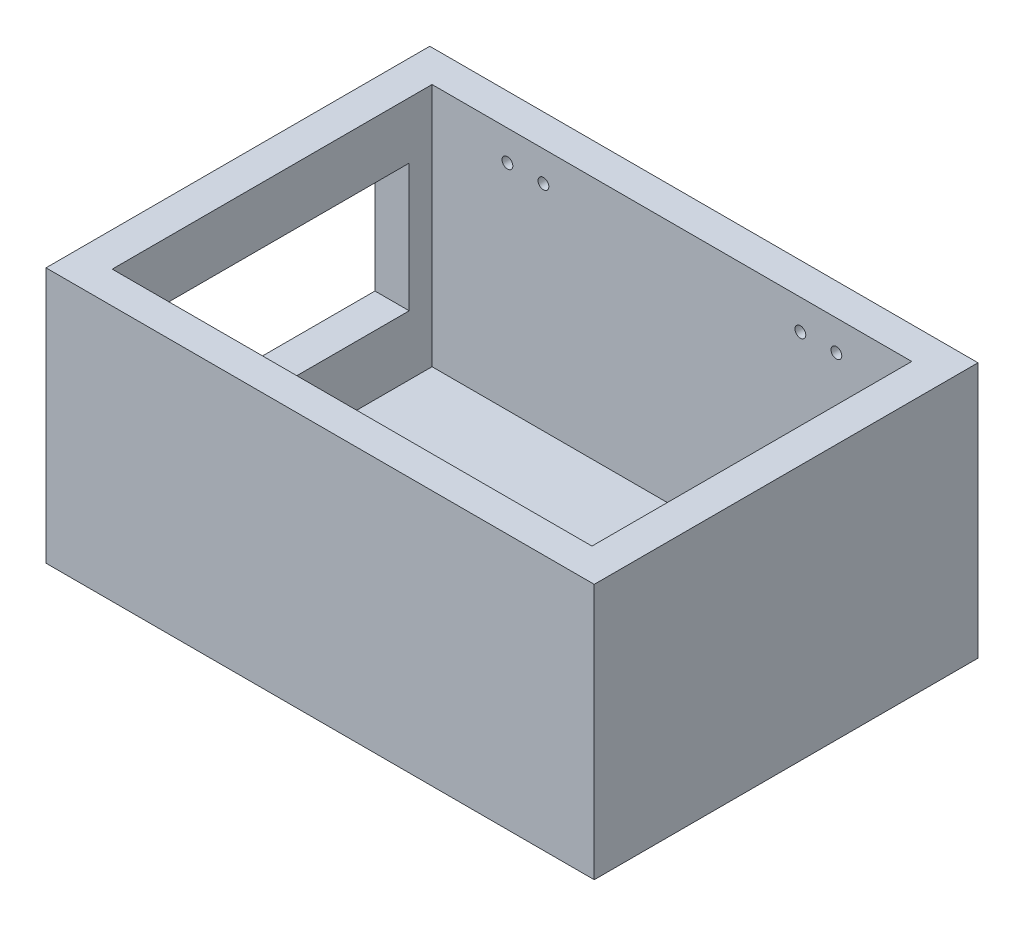
ISO-10303-21;
HEADER;
FILE_DESCRIPTION(('STEP AP214'),'2;1');
FILE_NAME('part.step','',(''),(''),'','','');
FILE_SCHEMA(('AUTOMOTIVE_DESIGN { 1 0 10303 214 1 1 1 1 }'));
ENDSEC;
DATA;
#1=APPLICATION_CONTEXT('core data for automotive mechanical design processes');
#2=APPLICATION_PROTOCOL_DEFINITION('international standard','automotive_design',2000,#1);
#3=PRODUCT_CONTEXT('',#1,'mechanical');
#4=PRODUCT('Part','Part','',(#3));
#5=PRODUCT_RELATED_PRODUCT_CATEGORY('part','',(#4));
#6=PRODUCT_DEFINITION_FORMATION('','',#4);
#7=PRODUCT_DEFINITION_CONTEXT('part definition',#1,'design');
#8=PRODUCT_DEFINITION('design','',#6,#7);
#9=PRODUCT_DEFINITION_SHAPE('','',#8);
#10=(LENGTH_UNIT() NAMED_UNIT(*) SI_UNIT(.MILLI.,.METRE.));
#11=(NAMED_UNIT(*) PLANE_ANGLE_UNIT() SI_UNIT($,.RADIAN.));
#12=(NAMED_UNIT(*) SI_UNIT($,.STERADIAN.) SOLID_ANGLE_UNIT());
#13=UNCERTAINTY_MEASURE_WITH_UNIT(LENGTH_MEASURE(1.E-05),#10,'distance_accuracy_value','');
#14=(GEOMETRIC_REPRESENTATION_CONTEXT(3) GLOBAL_UNCERTAINTY_ASSIGNED_CONTEXT((#13)) GLOBAL_UNIT_ASSIGNED_CONTEXT((#10,
#11,#12)) REPRESENTATION_CONTEXT('',''));
#15=CARTESIAN_POINT('',(0.,0.,0.));
#16=DIRECTION('',(0.,0.,1.));
#17=DIRECTION('',(1.,0.,0.));
#18=AXIS2_PLACEMENT_3D('',#15,#16,#17);
#19=CARTESIAN_POINT('',(142.875,3.175,97.79));
#20=DIRECTION('',(1.,0.,0.));
#21=DIRECTION('',(0.,0.,-1.));
#22=AXIS2_PLACEMENT_3D('',#19,#20,#21);
#23=PLANE('',#22);
#24=DIRECTION('',(0.,0.,1.));
#25=VECTOR('',#24,1.);
#26=CARTESIAN_POINT('',(142.875,52.705,42.418));
#27=LINE('',#26,#25);
#28=CARTESIAN_POINT('',(142.875,52.705,42.418));
#29=VERTEX_POINT('',#28);
#30=CARTESIAN_POINT('',(142.875,52.705,45.72));
#31=VERTEX_POINT('',#30);
#32=EDGE_CURVE('E327',#29,#31,#27,.T.);
#33=ORIENTED_EDGE('',*,*,#32,.T.);
#34=DIRECTION('',(0.,-1.,0.));
#35=VECTOR('',#34,1.);
#36=CARTESIAN_POINT('',(142.875,52.705,45.72));
#37=LINE('',#36,#35);
#38=CARTESIAN_POINT('',(142.875,3.175,45.72));
#39=VERTEX_POINT('',#38);
#40=EDGE_CURVE('E330',#31,#39,#37,.T.);
#41=ORIENTED_EDGE('',*,*,#40,.T.);
#42=DIRECTION('',(0.,0.,-1.));
#43=VECTOR('',#42,1.);
#44=CARTESIAN_POINT('',(142.875,3.175,97.79));
#45=LINE('',#44,#43);
#46=CARTESIAN_POINT('',(142.875,3.175,70.358));
#47=VERTEX_POINT('',#46);
#48=EDGE_CURVE('E383',#47,#39,#45,.T.);
#49=ORIENTED_EDGE('',*,*,#48,.F.);
#50=DIRECTION('',(0.,-1.,0.));
#51=VECTOR('',#50,1.);
#52=CARTESIAN_POINT('',(142.875,0.,70.358));
#53=LINE('',#52,#51);
#54=CARTESIAN_POINT('',(142.875,52.705,70.358));
#55=VERTEX_POINT('',#54);
#56=EDGE_CURVE('E357',#55,#47,#53,.T.);
#57=ORIENTED_EDGE('',*,*,#56,.F.);
#58=DIRECTION('',(0.,0.,-1.));
#59=VECTOR('',#58,1.);
#60=CARTESIAN_POINT('',(142.875,52.705,0.));
#61=LINE('',#60,#59);
#62=CARTESIAN_POINT('',(142.875,52.705,75.438));
#63=VERTEX_POINT('',#62);
#64=EDGE_CURVE('E332',#63,#55,#61,.T.);
#65=ORIENTED_EDGE('',*,*,#64,.F.);
#66=DIRECTION('',(0.,1.,0.));
#67=VECTOR('',#66,1.);
#68=CARTESIAN_POINT('',(142.875,0.,75.438));
#69=LINE('',#68,#67);
#70=CARTESIAN_POINT('',(142.875,3.175,75.438));
#71=VERTEX_POINT('',#70);
#72=EDGE_CURVE('E347',#71,#63,#69,.T.);
#73=ORIENTED_EDGE('',*,*,#72,.F.);
#74=CARTESIAN_POINT('',(142.875,3.175,97.79));
#75=VERTEX_POINT('',#74);
#76=EDGE_CURVE('E379',#75,#71,#45,.T.);
#77=ORIENTED_EDGE('',*,*,#76,.F.);
#78=DIRECTION('',(0.,1.,0.));
#79=VECTOR('',#78,1.);
#80=CARTESIAN_POINT('',(142.875,3.175,97.79));
#81=LINE('',#80,#79);
#82=CARTESIAN_POINT('',(142.875,71.12,97.79));
#83=VERTEX_POINT('',#82);
#84=EDGE_CURVE('E396',#75,#83,#81,.T.);
#85=ORIENTED_EDGE('',*,*,#84,.T.);
#86=DIRECTION('',(0.,0.,-1.));
#87=VECTOR('',#86,1.);
#88=CARTESIAN_POINT('',(142.875,71.12,97.79));
#89=LINE('',#88,#87);
#90=CARTESIAN_POINT('',(142.875,71.12,8.89));
#91=VERTEX_POINT('',#90);
#92=EDGE_CURVE('E374',#83,#91,#89,.T.);
#93=ORIENTED_EDGE('',*,*,#92,.T.);
#94=DIRECTION('',(0.,1.,0.));
#95=VECTOR('',#94,1.);
#96=CARTESIAN_POINT('',(142.875,3.175,8.89));
#97=LINE('',#96,#95);
#98=CARTESIAN_POINT('',(142.875,3.175,8.89));
#99=VERTEX_POINT('',#98);
#100=EDGE_CURVE('E393',#99,#91,#97,.T.);
#101=ORIENTED_EDGE('',*,*,#100,.F.);
#102=CARTESIAN_POINT('',(142.875,3.175,42.418));
#103=VERTEX_POINT('',#102);
#104=EDGE_CURVE('E378',#103,#99,#45,.T.);
#105=ORIENTED_EDGE('',*,*,#104,.F.);
#106=DIRECTION('',(0.,-1.,0.));
#107=VECTOR('',#106,1.);
#108=CARTESIAN_POINT('',(142.875,52.705,42.418));
#109=LINE('',#108,#107);
#110=EDGE_CURVE('E324',#29,#103,#109,.T.);
#111=ORIENTED_EDGE('',*,*,#110,.F.);
#112=EDGE_LOOP('',(#33,#41,#49,#57,#65,#73,#77,#85,#93,#101,#105,#111));
#113=FACE_BOUND('',#112,.T.);
#114=ADVANCED_FACE('F37',(#113),#23,.F.);
#115=CARTESIAN_POINT('',(0.,3.175,0.));
#116=DIRECTION('',(0.,-1.,0.));
#117=DIRECTION('',(0.,0.,-1.));
#118=AXIS2_PLACEMENT_3D('',#115,#116,#117);
#119=PLANE('',#118);
#120=ORIENTED_EDGE('',*,*,#48,.T.);
#121=DIRECTION('',(1.,0.,0.));
#122=VECTOR('',#121,1.);
#123=CARTESIAN_POINT('',(125.603,3.175,45.72));
#124=LINE('',#123,#122);
#125=CARTESIAN_POINT('',(125.603,3.175,45.72));
#126=VERTEX_POINT('',#125);
#127=EDGE_CURVE('E306',#126,#39,#124,.T.);
#128=ORIENTED_EDGE('',*,*,#127,.F.);
#129=DIRECTION('',(0.,0.,1.));
#130=VECTOR('',#129,1.);
#131=CARTESIAN_POINT('',(125.603,3.175,42.418));
#132=LINE('',#131,#130);
#133=CARTESIAN_POINT('',(125.603,3.175,42.418));
#134=VERTEX_POINT('',#133);
#135=EDGE_CURVE('E328',#134,#126,#132,.T.);
#136=ORIENTED_EDGE('',*,*,#135,.F.);
#137=DIRECTION('',(1.,0.,0.));
#138=VECTOR('',#137,1.);
#139=CARTESIAN_POINT('',(125.603,3.175,42.418));
#140=LINE('',#139,#138);
#141=EDGE_CURVE('E321',#134,#103,#140,.T.);
#142=ORIENTED_EDGE('',*,*,#141,.T.);
#143=ORIENTED_EDGE('',*,*,#104,.T.);
#144=DIRECTION('',(-1.,0.,0.));
#145=VECTOR('',#144,1.);
#146=CARTESIAN_POINT('',(142.875,3.175,8.89));
#147=LINE('',#146,#145);
#148=CARTESIAN_POINT('',(9.52500000000001,3.175,8.89000000000001));
#149=VERTEX_POINT('',#148);
#150=EDGE_CURVE('E370',#99,#149,#147,.T.);
#151=ORIENTED_EDGE('',*,*,#150,.T.);
#152=DIRECTION('',(0.,0.,-1.));
#153=VECTOR('',#152,1.);
#154=CARTESIAN_POINT('',(9.52500000000001,3.175,97.79));
#155=LINE('',#154,#153);
#156=CARTESIAN_POINT('',(9.52500000000001,3.175,97.79));
#157=VERTEX_POINT('',#156);
#158=EDGE_CURVE('E373',#157,#149,#155,.T.);
#159=ORIENTED_EDGE('',*,*,#158,.F.);
#160=DIRECTION('',(-1.,0.,0.));
#161=VECTOR('',#160,1.);
#162=CARTESIAN_POINT('',(142.875,3.175,97.79));
#163=LINE('',#162,#161);
#164=EDGE_CURVE('E376',#75,#157,#163,.T.);
#165=ORIENTED_EDGE('',*,*,#164,.F.);
#166=ORIENTED_EDGE('',*,*,#76,.T.);
#167=DIRECTION('',(1.,0.,0.));
#168=VECTOR('',#167,1.);
#169=CARTESIAN_POINT('',(125.603,3.175,75.438));
#170=LINE('',#169,#168);
#171=CARTESIAN_POINT('',(125.603,3.175,75.438));
#172=VERTEX_POINT('',#171);
#173=EDGE_CURVE('E362',#172,#71,#170,.T.);
#174=ORIENTED_EDGE('',*,*,#173,.F.);
#175=DIRECTION('',(0.,0.,1.));
#176=VECTOR('',#175,1.);
#177=CARTESIAN_POINT('',(125.603,3.175,0.));
#178=LINE('',#177,#176);
#179=CARTESIAN_POINT('',(125.603,3.175,70.358));
#180=VERTEX_POINT('',#179);
#181=EDGE_CURVE('E350',#180,#172,#178,.T.);
#182=ORIENTED_EDGE('',*,*,#181,.F.);
#183=DIRECTION('',(1.,0.,0.));
#184=VECTOR('',#183,1.);
#185=CARTESIAN_POINT('',(125.603,3.175,70.358));
#186=LINE('',#185,#184);
#187=EDGE_CURVE('E364',#180,#47,#186,.T.);
#188=ORIENTED_EDGE('',*,*,#187,.T.);
#189=EDGE_LOOP('',(#120,#128,#136,#142,#143,#151,#159,#165,#166,#174,#182,#188));
#190=FACE_BOUND('',#189,.T.);
#191=ADVANCED_FACE('F457',(#190),#119,.F.);
#192=CARTESIAN_POINT('',(0.,71.12,0.));
#193=DIRECTION('',(1.,0.,0.));
#194=DIRECTION('',(0.,0.,-1.));
#195=AXIS2_PLACEMENT_3D('',#192,#193,#194);
#196=PLANE('',#195);
#197=DIRECTION('',(0.,0.,1.));
#198=VECTOR('',#197,1.);
#199=CARTESIAN_POINT('',(0.,5.842,67.31));
#200=LINE('',#199,#198);
#201=CARTESIAN_POINT('',(0.,5.842,67.31));
#202=VERTEX_POINT('',#201);
#203=CARTESIAN_POINT('',(0.,5.842,78.74));
#204=VERTEX_POINT('',#203);
#205=EDGE_CURVE('E227',#202,#204,#200,.T.);
#206=ORIENTED_EDGE('',*,*,#205,.F.);
#207=DIRECTION('',(0.,-1.,0.));
#208=VECTOR('',#207,1.);
#209=CARTESIAN_POINT('',(0.,5.842,67.31));
#210=LINE('',#209,#208);
#211=CARTESIAN_POINT('',(0.,17.272,67.31));
#212=VERTEX_POINT('',#211);
#213=EDGE_CURVE('E54',#212,#202,#210,.T.);
#214=ORIENTED_EDGE('',*,*,#213,.F.);
#215=DIRECTION('',(0.,0.,-1.));
#216=VECTOR('',#215,1.);
#217=CARTESIAN_POINT('',(0.,17.272,67.31));
#218=LINE('',#217,#216);
#219=CARTESIAN_POINT('',(0.,17.272,78.74));
#220=VERTEX_POINT('',#219);
#221=EDGE_CURVE('E218',#220,#212,#218,.T.);
#222=ORIENTED_EDGE('',*,*,#221,.F.);
#223=DIRECTION('',(0.,1.,0.));
#224=VECTOR('',#223,1.);
#225=CARTESIAN_POINT('',(0.,5.842,78.74));
#226=LINE('',#225,#224);
#227=EDGE_CURVE('E221',#204,#220,#226,.T.);
#228=ORIENTED_EDGE('',*,*,#227,.F.);
#229=EDGE_LOOP('',(#206,#214,#222,#228));
#230=FACE_BOUND('',#229,.T.);
#231=CARTESIAN_POINT('',(0.,63.221423834193,53.34));
#232=DIRECTION('',(-1.,0.,0.));
#233=DIRECTION('',(0.,0.,1.));
#234=AXIS2_PLACEMENT_3D('',#231,#232,#233);
#235=CIRCLE('',#234,1.905);
#236=CARTESIAN_POINT('',(0.,63.221423834193,55.245));
#237=VERTEX_POINT('',#236);
#238=EDGE_CURVE('E233',#237,#237,#235,.T.);
#239=ORIENTED_EDGE('',*,*,#238,.F.);
#240=EDGE_LOOP('',(#239));
#241=FACE_BOUND('',#240,.T.);
#242=DIRECTION('',(0.,-1.,0.));
#243=VECTOR('',#242,1.);
#244=CARTESIAN_POINT('',(0.,55.372,91.44));
#245=LINE('',#244,#243);
#246=CARTESIAN_POINT('',(0.,55.372,91.44));
#247=VERTEX_POINT('',#246);
#248=CARTESIAN_POINT('',(0.,19.812,91.44));
#249=VERTEX_POINT('',#248);
#250=EDGE_CURVE('E296',#247,#249,#245,.T.);
#251=ORIENTED_EDGE('',*,*,#250,.T.);
#252=DIRECTION('',(0.,0.,1.));
#253=VECTOR('',#252,1.);
#254=CARTESIAN_POINT('',(0.,19.812,15.24));
#255=LINE('',#254,#253);
#256=CARTESIAN_POINT('',(0.,19.812,15.24));
#257=VERTEX_POINT('',#256);
#258=EDGE_CURVE('E281',#257,#249,#255,.T.);
#259=ORIENTED_EDGE('',*,*,#258,.F.);
#260=DIRECTION('',(0.,-1.,0.));
#261=VECTOR('',#260,1.);
#262=CARTESIAN_POINT('',(0.,55.372,15.24));
#263=LINE('',#262,#261);
#264=CARTESIAN_POINT('',(0.,55.372,15.24));
#265=VERTEX_POINT('',#264);
#266=EDGE_CURVE('E286',#265,#257,#263,.T.);
#267=ORIENTED_EDGE('',*,*,#266,.F.);
#268=DIRECTION('',(0.,0.,1.));
#269=VECTOR('',#268,1.);
#270=CARTESIAN_POINT('',(0.,55.372,15.24));
#271=LINE('',#270,#269);
#272=EDGE_CURVE('E299',#265,#247,#271,.T.);
#273=ORIENTED_EDGE('',*,*,#272,.T.);
#274=EDGE_LOOP('',(#251,#259,#267,#273));
#275=FACE_BOUND('',#274,.T.);
#276=DIRECTION('',(0.,0.,1.));
#277=VECTOR('',#276,1.);
#278=CARTESIAN_POINT('',(0.,0.,0.));
#279=LINE('',#278,#277);
#280=CARTESIAN_POINT('',(0.,0.,0.));
#281=VERTEX_POINT('',#280);
#282=CARTESIAN_POINT('',(0.,0.,106.68));
#283=VERTEX_POINT('',#282);
#284=EDGE_CURVE('E395',#281,#283,#279,.T.);
#285=ORIENTED_EDGE('',*,*,#284,.T.);
#286=DIRECTION('',(0.,-1.,0.));
#287=VECTOR('',#286,1.);
#288=CARTESIAN_POINT('',(0.,71.12,106.68));
#289=LINE('',#288,#287);
#290=CARTESIAN_POINT('',(0.,71.12,106.68));
#291=VERTEX_POINT('',#290);
#292=EDGE_CURVE('E11',#291,#283,#289,.T.);
#293=ORIENTED_EDGE('',*,*,#292,.F.);
#294=DIRECTION('',(0.,0.,1.));
#295=VECTOR('',#294,1.);
#296=CARTESIAN_POINT('',(0.,71.12,0.));
#297=LINE('',#296,#295);
#298=CARTESIAN_POINT('',(0.,71.12,0.));
#299=VERTEX_POINT('',#298);
#300=EDGE_CURVE('E402',#299,#291,#297,.T.);
#301=ORIENTED_EDGE('',*,*,#300,.F.);
#302=DIRECTION('',(0.,-1.,0.));
#303=VECTOR('',#302,1.);
#304=CARTESIAN_POINT('',(0.,71.12,0.));
#305=LINE('',#304,#303);
#306=EDGE_CURVE('E412',#299,#281,#305,.T.);
#307=ORIENTED_EDGE('',*,*,#306,.T.);
#308=EDGE_LOOP('',(#285,#293,#301,#307));
#309=FACE_BOUND('',#308,.T.);
#310=ADVANCED_FACE('F39',(#230,#241,#275,#309),#196,.F.);
#311=CARTESIAN_POINT('',(0.,71.12,106.68));
#312=DIRECTION('',(0.,0.,-1.));
#313=DIRECTION('',(-1.,0.,0.));
#314=AXIS2_PLACEMENT_3D('',#311,#312,#313);
#315=PLANE('',#314);
#316=DIRECTION('',(1.,0.,0.));
#317=VECTOR('',#316,1.);
#318=CARTESIAN_POINT('',(0.,0.,106.68));
#319=LINE('',#318,#317);
#320=CARTESIAN_POINT('',(152.4,0.,106.68));
#321=VERTEX_POINT('',#320);
#322=EDGE_CURVE('E415',#283,#321,#319,.T.);
#323=ORIENTED_EDGE('',*,*,#322,.T.);
#324=DIRECTION('',(0.,-1.,0.));
#325=VECTOR('',#324,1.);
#326=CARTESIAN_POINT('',(152.4,71.12,106.68));
#327=LINE('',#326,#325);
#328=CARTESIAN_POINT('',(152.4,71.12,106.68));
#329=VERTEX_POINT('',#328);
#330=EDGE_CURVE('E46',#329,#321,#327,.T.);
#331=ORIENTED_EDGE('',*,*,#330,.F.);
#332=DIRECTION('',(1.,0.,0.));
#333=VECTOR('',#332,1.);
#334=CARTESIAN_POINT('',(0.,71.12,106.68));
#335=LINE('',#334,#333);
#336=EDGE_CURVE('E405',#291,#329,#335,.T.);
#337=ORIENTED_EDGE('',*,*,#336,.F.);
#338=ORIENTED_EDGE('',*,*,#292,.T.);
#339=EDGE_LOOP('',(#323,#331,#337,#338));
#340=FACE_BOUND('',#339,.T.);
#341=ADVANCED_FACE('F491',(#340),#315,.F.);
#342=CARTESIAN_POINT('',(152.4,71.12,0.));
#343=DIRECTION('',(-1.,0.,0.));
#344=DIRECTION('',(0.,0.,1.));
#345=AXIS2_PLACEMENT_3D('',#342,#343,#344);
#346=PLANE('',#345);
#347=DIRECTION('',(0.,0.,-1.));
#348=VECTOR('',#347,1.);
#349=CARTESIAN_POINT('',(152.4,0.,0.));
#350=LINE('',#349,#348);
#351=CARTESIAN_POINT('',(152.4,0.,0.));
#352=VERTEX_POINT('',#351);
#353=EDGE_CURVE('E417',#321,#352,#350,.T.);
#354=ORIENTED_EDGE('',*,*,#353,.T.);
#355=DIRECTION('',(0.,-1.,0.));
#356=VECTOR('',#355,1.);
#357=CARTESIAN_POINT('',(152.4,71.12,0.));
#358=LINE('',#357,#356);
#359=CARTESIAN_POINT('',(152.4,71.12,0.));
#360=VERTEX_POINT('',#359);
#361=EDGE_CURVE('E422',#360,#352,#358,.T.);
#362=ORIENTED_EDGE('',*,*,#361,.F.);
#363=DIRECTION('',(0.,0.,-1.));
#364=VECTOR('',#363,1.);
#365=CARTESIAN_POINT('',(152.4,71.12,0.));
#366=LINE('',#365,#364);
#367=EDGE_CURVE('E408',#329,#360,#366,.T.);
#368=ORIENTED_EDGE('',*,*,#367,.F.);
#369=ORIENTED_EDGE('',*,*,#330,.T.);
#370=EDGE_LOOP('',(#354,#362,#368,#369));
#371=FACE_BOUND('',#370,.T.);
#372=ADVANCED_FACE('F488',(#371),#346,.F.);
#373=CARTESIAN_POINT('',(0.,71.12,0.));
#374=DIRECTION('',(0.,0.,1.));
#375=DIRECTION('',(1.,0.,0.));
#376=AXIS2_PLACEMENT_3D('',#373,#374,#375);
#377=PLANE('',#376);
#378=DIRECTION('',(-1.,0.,0.));
#379=VECTOR('',#378,1.);
#380=CARTESIAN_POINT('',(0.,0.,0.));
#381=LINE('',#380,#379);
#382=EDGE_CURVE('E406',#352,#281,#381,.T.);
#383=ORIENTED_EDGE('',*,*,#382,.T.);
#384=ORIENTED_EDGE('',*,*,#306,.F.);
#385=DIRECTION('',(-1.,0.,0.));
#386=VECTOR('',#385,1.);
#387=CARTESIAN_POINT('',(0.,71.12,0.));
#388=LINE('',#387,#386);
#389=EDGE_CURVE('E410',#360,#299,#388,.T.);
#390=ORIENTED_EDGE('',*,*,#389,.F.);
#391=ORIENTED_EDGE('',*,*,#361,.T.);
#392=EDGE_LOOP('',(#383,#384,#390,#391));
#393=FACE_BOUND('',#392,.T.);
#394=ADVANCED_FACE('F481',(#393),#377,.F.);
#395=CARTESIAN_POINT('',(0.,71.12,0.));
#396=DIRECTION('',(0.,1.,0.));
#397=DIRECTION('',(0.,0.,1.));
#398=AXIS2_PLACEMENT_3D('',#395,#396,#397);
#399=PLANE('',#398);
#400=DIRECTION('',(-1.,0.,0.));
#401=VECTOR('',#400,1.);
#402=CARTESIAN_POINT('',(142.875,71.12,8.89));
#403=LINE('',#402,#401);
#404=CARTESIAN_POINT('',(9.52500000000001,71.12,8.89000000000001));
#405=VERTEX_POINT('',#404);
#406=EDGE_CURVE('E369',#91,#405,#403,.T.);
#407=ORIENTED_EDGE('',*,*,#406,.F.);
#408=ORIENTED_EDGE('',*,*,#92,.F.);
#409=DIRECTION('',(-1.,0.,0.));
#410=VECTOR('',#409,1.);
#411=CARTESIAN_POINT('',(142.875,71.12,97.79));
#412=LINE('',#411,#410);
#413=CARTESIAN_POINT('',(9.52500000000001,71.12,97.79));
#414=VERTEX_POINT('',#413);
#415=EDGE_CURVE('E388',#83,#414,#412,.T.);
#416=ORIENTED_EDGE('',*,*,#415,.T.);
#417=DIRECTION('',(0.,0.,-1.));
#418=VECTOR('',#417,1.);
#419=CARTESIAN_POINT('',(9.52500000000001,71.12,97.79));
#420=LINE('',#419,#418);
#421=EDGE_CURVE('E385',#414,#405,#420,.T.);
#422=ORIENTED_EDGE('',*,*,#421,.T.);
#423=EDGE_LOOP('',(#407,#408,#416,#422));
#424=FACE_BOUND('',#423,.T.);
#425=ORIENTED_EDGE('',*,*,#300,.T.);
#426=ORIENTED_EDGE('',*,*,#336,.T.);
#427=ORIENTED_EDGE('',*,*,#367,.T.);
#428=ORIENTED_EDGE('',*,*,#389,.T.);
#429=EDGE_LOOP('',(#425,#426,#427,#428));
#430=FACE_BOUND('',#429,.T.);
#431=ADVANCED_FACE('F478',(#424,#430),#399,.T.);
#432=CARTESIAN_POINT('',(0.,0.,0.));
#433=DIRECTION('',(0.,1.,0.));
#434=DIRECTION('',(0.,0.,1.));
#435=AXIS2_PLACEMENT_3D('',#432,#433,#434);
#436=PLANE('',#435);
#437=ORIENTED_EDGE('',*,*,#284,.F.);
#438=ORIENTED_EDGE('',*,*,#382,.F.);
#439=ORIENTED_EDGE('',*,*,#353,.F.);
#440=ORIENTED_EDGE('',*,*,#322,.F.);
#441=EDGE_LOOP('',(#437,#438,#439,#440));
#442=FACE_BOUND('',#441,.T.);
#443=ADVANCED_FACE('F476',(#442),#436,.F.);
#444=CARTESIAN_POINT('',(142.875,3.175,8.89));
#445=DIRECTION('',(0.,0.,-1.));
#446=DIRECTION('',(-1.,0.,0.));
#447=AXIS2_PLACEMENT_3D('',#444,#445,#446);
#448=PLANE('',#447);
#449=CARTESIAN_POINT('',(30.48,62.738,8.89000000000001));
#450=DIRECTION('',(0.,0.,-1.));
#451=DIRECTION('',(-1.,0.,0.));
#452=AXIS2_PLACEMENT_3D('',#449,#450,#451);
#453=CIRCLE('',#452,1.4986);
#454=CARTESIAN_POINT('',(28.9814,62.738,8.89000000000001));
#455=VERTEX_POINT('',#454);
#456=EDGE_CURVE('E278',#455,#455,#453,.F.);
#457=ORIENTED_EDGE('',*,*,#456,.F.);
#458=EDGE_LOOP('',(#457));
#459=FACE_BOUND('',#458,.T.);
#460=CARTESIAN_POINT('',(40.4876,62.738,8.89000000000001));
#461=DIRECTION('',(0.,0.,-1.));
#462=DIRECTION('',(-1.,0.,0.));
#463=AXIS2_PLACEMENT_3D('',#460,#461,#462);
#464=CIRCLE('',#463,1.4986);
#465=CARTESIAN_POINT('',(38.989,62.738,8.89000000000001));
#466=VERTEX_POINT('',#465);
#467=EDGE_CURVE('E275',#466,#466,#464,.F.);
#468=ORIENTED_EDGE('',*,*,#467,.F.);
#469=EDGE_LOOP('',(#468));
#470=FACE_BOUND('',#469,.T.);
#471=CARTESIAN_POINT('',(111.9124,62.738,8.89));
#472=DIRECTION('',(0.,0.,-1.));
#473=DIRECTION('',(-1.,0.,0.));
#474=AXIS2_PLACEMENT_3D('',#471,#472,#473);
#475=CIRCLE('',#474,1.4986);
#476=CARTESIAN_POINT('',(110.4138,62.738,8.89));
#477=VERTEX_POINT('',#476);
#478=EDGE_CURVE('E271',#477,#477,#475,.F.);
#479=ORIENTED_EDGE('',*,*,#478,.F.);
#480=EDGE_LOOP('',(#479));
#481=FACE_BOUND('',#480,.T.);
#482=CARTESIAN_POINT('',(121.92,62.738,8.89));
#483=DIRECTION('',(0.,0.,-1.));
#484=DIRECTION('',(-1.,0.,0.));
#485=AXIS2_PLACEMENT_3D('',#482,#483,#484);
#486=CIRCLE('',#485,1.4986);
#487=CARTESIAN_POINT('',(120.4214,62.738,8.89));
#488=VERTEX_POINT('',#487);
#489=EDGE_CURVE('E267',#488,#488,#486,.F.);
#490=ORIENTED_EDGE('',*,*,#489,.F.);
#491=EDGE_LOOP('',(#490));
#492=FACE_BOUND('',#491,.T.);
#493=ORIENTED_EDGE('',*,*,#406,.T.);
#494=DIRECTION('',(0.,1.,0.));
#495=VECTOR('',#494,1.);
#496=CARTESIAN_POINT('',(9.52500000000001,3.175,8.89000000000001));
#497=LINE('',#496,#495);
#498=EDGE_CURVE('E382',#149,#405,#497,.T.);
#499=ORIENTED_EDGE('',*,*,#498,.F.);
#500=ORIENTED_EDGE('',*,*,#150,.F.);
#501=ORIENTED_EDGE('',*,*,#100,.T.);
#502=EDGE_LOOP('',(#493,#499,#500,#501));
#503=FACE_BOUND('',#502,.T.);
#504=ADVANCED_FACE('F469',(#459,#470,#481,#492,#503),#448,.F.);
#505=CARTESIAN_POINT('',(142.875,3.175,97.79));
#506=DIRECTION('',(0.,0.,-1.));
#507=DIRECTION('',(-1.,0.,0.));
#508=AXIS2_PLACEMENT_3D('',#505,#506,#507);
#509=PLANE('',#508);
#510=CARTESIAN_POINT('',(30.48,62.738,97.79));
#511=DIRECTION('',(0.,0.,-1.));
#512=DIRECTION('',(-1.,0.,0.));
#513=AXIS2_PLACEMENT_3D('',#510,#511,#512);
#514=CIRCLE('',#513,1.4986);
#515=CARTESIAN_POINT('',(28.9814,62.738,97.79));
#516=VERTEX_POINT('',#515);
#517=EDGE_CURVE('E41',#516,#516,#514,.F.);
#518=ORIENTED_EDGE('',*,*,#517,.T.);
#519=EDGE_LOOP('',(#518));
#520=FACE_BOUND('',#519,.T.);
#521=CARTESIAN_POINT('',(40.4876,62.738,97.79));
#522=DIRECTION('',(0.,0.,-1.));
#523=DIRECTION('',(-1.,0.,0.));
#524=AXIS2_PLACEMENT_3D('',#521,#522,#523);
#525=CIRCLE('',#524,1.4986);
#526=CARTESIAN_POINT('',(38.989,62.738,97.79));
#527=VERTEX_POINT('',#526);
#528=EDGE_CURVE('E274',#527,#527,#525,.F.);
#529=ORIENTED_EDGE('',*,*,#528,.T.);
#530=EDGE_LOOP('',(#529));
#531=FACE_BOUND('',#530,.T.);
#532=CARTESIAN_POINT('',(111.9124,62.738,97.79));
#533=DIRECTION('',(0.,0.,-1.));
#534=DIRECTION('',(-1.,0.,0.));
#535=AXIS2_PLACEMENT_3D('',#532,#533,#534);
#536=CIRCLE('',#535,1.4986);
#537=CARTESIAN_POINT('',(110.4138,62.738,97.79));
#538=VERTEX_POINT('',#537);
#539=EDGE_CURVE('E270',#538,#538,#536,.F.);
#540=ORIENTED_EDGE('',*,*,#539,.T.);
#541=EDGE_LOOP('',(#540));
#542=FACE_BOUND('',#541,.T.);
#543=CARTESIAN_POINT('',(121.92,62.738,97.79));
#544=DIRECTION('',(0.,0.,-1.));
#545=DIRECTION('',(-1.,0.,0.));
#546=AXIS2_PLACEMENT_3D('',#543,#544,#545);
#547=CIRCLE('',#546,1.4986);
#548=CARTESIAN_POINT('',(120.4214,62.738,97.79));
#549=VERTEX_POINT('',#548);
#550=EDGE_CURVE('E250',#549,#549,#547,.F.);
#551=ORIENTED_EDGE('',*,*,#550,.T.);
#552=EDGE_LOOP('',(#551));
#553=FACE_BOUND('',#552,.T.);
#554=ORIENTED_EDGE('',*,*,#415,.F.);
#555=ORIENTED_EDGE('',*,*,#84,.F.);
#556=ORIENTED_EDGE('',*,*,#164,.T.);
#557=DIRECTION('',(0.,1.,0.));
#558=VECTOR('',#557,1.);
#559=CARTESIAN_POINT('',(9.52500000000001,3.175,97.79));
#560=LINE('',#559,#558);
#561=EDGE_CURVE('E398',#157,#414,#560,.T.);
#562=ORIENTED_EDGE('',*,*,#561,.T.);
#563=EDGE_LOOP('',(#554,#555,#556,#562));
#564=FACE_BOUND('',#563,.T.);
#565=ADVANCED_FACE('F433',(#520,#531,#542,#553,#564),#509,.T.);
#566=CARTESIAN_POINT('',(9.52500000000001,3.175,97.79));
#567=DIRECTION('',(1.,0.,0.));
#568=DIRECTION('',(0.,0.,-1.));
#569=AXIS2_PLACEMENT_3D('',#566,#567,#568);
#570=PLANE('',#569);
#571=DIRECTION('',(0.,-1.,0.));
#572=VECTOR('',#571,1.);
#573=CARTESIAN_POINT('',(9.52500000000001,5.842,67.31));
#574=LINE('',#573,#572);
#575=CARTESIAN_POINT('',(9.52500000000001,17.272,67.31));
#576=VERTEX_POINT('',#575);
#577=CARTESIAN_POINT('',(9.52500000000001,5.842,67.31));
#578=VERTEX_POINT('',#577);
#579=EDGE_CURVE('E202',#576,#578,#574,.T.);
#580=ORIENTED_EDGE('',*,*,#579,.T.);
#581=DIRECTION('',(0.,0.,1.));
#582=VECTOR('',#581,1.);
#583=CARTESIAN_POINT('',(9.52500000000001,5.842,67.31));
#584=LINE('',#583,#582);
#585=CARTESIAN_POINT('',(9.52500000000001,5.842,78.74));
#586=VERTEX_POINT('',#585);
#587=EDGE_CURVE('E211',#578,#586,#584,.T.);
#588=ORIENTED_EDGE('',*,*,#587,.T.);
#589=DIRECTION('',(0.,1.,0.));
#590=VECTOR('',#589,1.);
#591=CARTESIAN_POINT('',(9.52500000000001,5.842,78.74));
#592=LINE('',#591,#590);
#593=CARTESIAN_POINT('',(9.52500000000001,17.272,78.74));
#594=VERTEX_POINT('',#593);
#595=EDGE_CURVE('E62',#586,#594,#592,.T.);
#596=ORIENTED_EDGE('',*,*,#595,.T.);
#597=DIRECTION('',(0.,0.,-1.));
#598=VECTOR('',#597,1.);
#599=CARTESIAN_POINT('',(9.52500000000001,17.272,67.31));
#600=LINE('',#599,#598);
#601=EDGE_CURVE('E208',#594,#576,#600,.T.);
#602=ORIENTED_EDGE('',*,*,#601,.T.);
#603=EDGE_LOOP('',(#580,#588,#596,#602));
#604=FACE_BOUND('',#603,.T.);
#605=DIRECTION('',(0.,0.,1.));
#606=VECTOR('',#605,1.);
#607=CARTESIAN_POINT('',(9.525,19.812,15.24));
#608=LINE('',#607,#606);
#609=CARTESIAN_POINT('',(9.525,19.812,15.24));
#610=VERTEX_POINT('',#609);
#611=CARTESIAN_POINT('',(9.52500000000001,19.812,91.44));
#612=VERTEX_POINT('',#611);
#613=EDGE_CURVE('E282',#610,#612,#608,.T.);
#614=ORIENTED_EDGE('',*,*,#613,.T.);
#615=DIRECTION('',(0.,-1.,0.));
#616=VECTOR('',#615,1.);
#617=CARTESIAN_POINT('',(9.52500000000001,55.372,91.44));
#618=LINE('',#617,#616);
#619=CARTESIAN_POINT('',(9.52500000000001,55.372,91.44));
#620=VERTEX_POINT('',#619);
#621=EDGE_CURVE('E285',#620,#612,#618,.T.);
#622=ORIENTED_EDGE('',*,*,#621,.F.);
#623=DIRECTION('',(0.,0.,1.));
#624=VECTOR('',#623,1.);
#625=CARTESIAN_POINT('',(9.525,55.372,15.24));
#626=LINE('',#625,#624);
#627=CARTESIAN_POINT('',(9.525,55.372,15.24));
#628=VERTEX_POINT('',#627);
#629=EDGE_CURVE('E288',#628,#620,#626,.T.);
#630=ORIENTED_EDGE('',*,*,#629,.F.);
#631=DIRECTION('',(0.,-1.,0.));
#632=VECTOR('',#631,1.);
#633=CARTESIAN_POINT('',(9.525,55.372,15.24));
#634=LINE('',#633,#632);
#635=EDGE_CURVE('E291',#628,#610,#634,.T.);
#636=ORIENTED_EDGE('',*,*,#635,.T.);
#637=EDGE_LOOP('',(#614,#622,#630,#636));
#638=FACE_BOUND('',#637,.T.);
#639=ORIENTED_EDGE('',*,*,#421,.F.);
#640=ORIENTED_EDGE('',*,*,#561,.F.);
#641=ORIENTED_EDGE('',*,*,#158,.T.);
#642=ORIENTED_EDGE('',*,*,#498,.T.);
#643=EDGE_LOOP('',(#639,#640,#641,#642));
#644=FACE_BOUND('',#643,.T.);
#645=ADVANCED_FACE('F215',(#604,#638,#644),#570,.T.);
#646=CARTESIAN_POINT('',(125.603,52.705,0.));
#647=DIRECTION('',(0.,-1.,0.));
#648=DIRECTION('',(0.,0.,-1.));
#649=AXIS2_PLACEMENT_3D('',#646,#647,#648);
#650=PLANE('',#649);
#651=ORIENTED_EDGE('',*,*,#64,.T.);
#652=DIRECTION('',(1.,0.,0.));
#653=VECTOR('',#652,1.);
#654=CARTESIAN_POINT('',(125.603,52.705,70.358));
#655=LINE('',#654,#653);
#656=CARTESIAN_POINT('',(125.603,52.705,70.358));
#657=VERTEX_POINT('',#656);
#658=EDGE_CURVE('E367',#657,#55,#655,.T.);
#659=ORIENTED_EDGE('',*,*,#658,.F.);
#660=DIRECTION('',(0.,0.,-1.));
#661=VECTOR('',#660,1.);
#662=CARTESIAN_POINT('',(125.603,52.705,0.));
#663=LINE('',#662,#661);
#664=CARTESIAN_POINT('',(125.603,52.705,75.438));
#665=VERTEX_POINT('',#664);
#666=EDGE_CURVE('E343',#665,#657,#663,.T.);
#667=ORIENTED_EDGE('',*,*,#666,.F.);
#668=DIRECTION('',(1.,0.,0.));
#669=VECTOR('',#668,1.);
#670=CARTESIAN_POINT('',(125.603,52.705,75.438));
#671=LINE('',#670,#669);
#672=EDGE_CURVE('E354',#665,#63,#671,.T.);
#673=ORIENTED_EDGE('',*,*,#672,.T.);
#674=EDGE_LOOP('',(#651,#659,#667,#673));
#675=FACE_BOUND('',#674,.T.);
#676=ADVANCED_FACE('F473',(#675),#650,.F.);
#677=CARTESIAN_POINT('',(125.603,0.,70.358));
#678=DIRECTION('',(0.,0.,1.));
#679=DIRECTION('',(0.,-1.,0.));
#680=AXIS2_PLACEMENT_3D('',#677,#678,#679);
#681=PLANE('',#680);
#682=ORIENTED_EDGE('',*,*,#56,.T.);
#683=ORIENTED_EDGE('',*,*,#187,.F.);
#684=DIRECTION('',(0.,-1.,0.));
#685=VECTOR('',#684,1.);
#686=CARTESIAN_POINT('',(125.603,0.,70.358));
#687=LINE('',#686,#685);
#688=EDGE_CURVE('E346',#657,#180,#687,.T.);
#689=ORIENTED_EDGE('',*,*,#688,.F.);
#690=ORIENTED_EDGE('',*,*,#658,.T.);
#691=EDGE_LOOP('',(#682,#683,#689,#690));
#692=FACE_BOUND('',#691,.T.);
#693=ADVANCED_FACE('F571',(#692),#681,.F.);
#694=CARTESIAN_POINT('',(125.603,0.,75.438));
#695=DIRECTION('',(0.,0.,-1.));
#696=DIRECTION('',(0.,1.,0.));
#697=AXIS2_PLACEMENT_3D('',#694,#695,#696);
#698=PLANE('',#697);
#699=ORIENTED_EDGE('',*,*,#72,.T.);
#700=ORIENTED_EDGE('',*,*,#672,.F.);
#701=DIRECTION('',(0.,1.,0.));
#702=VECTOR('',#701,1.);
#703=CARTESIAN_POINT('',(125.603,0.,75.438));
#704=LINE('',#703,#702);
#705=EDGE_CURVE('E352',#172,#665,#704,.T.);
#706=ORIENTED_EDGE('',*,*,#705,.F.);
#707=ORIENTED_EDGE('',*,*,#173,.T.);
#708=EDGE_LOOP('',(#699,#700,#706,#707));
#709=FACE_BOUND('',#708,.T.);
#710=ADVANCED_FACE('F567',(#709),#698,.F.);
#711=CARTESIAN_POINT('',(125.603,0.,0.));
#712=DIRECTION('',(-1.,0.,0.));
#713=DIRECTION('',(0.,0.,1.));
#714=AXIS2_PLACEMENT_3D('',#711,#712,#713);
#715=PLANE('',#714);
#716=ORIENTED_EDGE('',*,*,#666,.T.);
#717=ORIENTED_EDGE('',*,*,#688,.T.);
#718=ORIENTED_EDGE('',*,*,#181,.T.);
#719=ORIENTED_EDGE('',*,*,#705,.T.);
#720=EDGE_LOOP('',(#716,#717,#718,#719));
#721=FACE_BOUND('',#720,.T.);
#722=ADVANCED_FACE('F553',(#721),#715,.T.);
#723=CARTESIAN_POINT('',(125.603,52.705,45.72));
#724=DIRECTION('',(0.,0.,1.));
#725=DIRECTION('',(0.,-1.,0.));
#726=AXIS2_PLACEMENT_3D('',#723,#724,#725);
#727=PLANE('',#726);
#728=ORIENTED_EDGE('',*,*,#40,.F.);
#729=DIRECTION('',(1.,0.,0.));
#730=VECTOR('',#729,1.);
#731=CARTESIAN_POINT('',(125.603,52.705,45.72));
#732=LINE('',#731,#730);
#733=CARTESIAN_POINT('',(125.603,52.705,45.72));
#734=VERTEX_POINT('',#733);
#735=EDGE_CURVE('E315',#734,#31,#732,.T.);
#736=ORIENTED_EDGE('',*,*,#735,.F.);
#737=DIRECTION('',(0.,-1.,0.));
#738=VECTOR('',#737,1.);
#739=CARTESIAN_POINT('',(125.603,52.705,45.72));
#740=LINE('',#739,#738);
#741=EDGE_CURVE('E338',#734,#126,#740,.T.);
#742=ORIENTED_EDGE('',*,*,#741,.T.);
#743=ORIENTED_EDGE('',*,*,#127,.T.);
#744=EDGE_LOOP('',(#728,#736,#742,#743));
#745=FACE_BOUND('',#744,.T.);
#746=ADVANCED_FACE('F549',(#745),#727,.T.);
#747=CARTESIAN_POINT('',(125.603,52.705,42.418));
#748=DIRECTION('',(0.,1.,0.));
#749=DIRECTION('',(0.,0.,1.));
#750=AXIS2_PLACEMENT_3D('',#747,#748,#749);
#751=PLANE('',#750);
#752=ORIENTED_EDGE('',*,*,#32,.F.);
#753=DIRECTION('',(1.,0.,0.));
#754=VECTOR('',#753,1.);
#755=CARTESIAN_POINT('',(125.603,52.705,42.418));
#756=LINE('',#755,#754);
#757=CARTESIAN_POINT('',(125.603,52.705,42.418));
#758=VERTEX_POINT('',#757);
#759=EDGE_CURVE('E318',#758,#29,#756,.T.);
#760=ORIENTED_EDGE('',*,*,#759,.F.);
#761=DIRECTION('',(0.,0.,1.));
#762=VECTOR('',#761,1.);
#763=CARTESIAN_POINT('',(125.603,52.705,42.418));
#764=LINE('',#763,#762);
#765=EDGE_CURVE('E335',#758,#734,#764,.T.);
#766=ORIENTED_EDGE('',*,*,#765,.T.);
#767=ORIENTED_EDGE('',*,*,#735,.T.);
#768=EDGE_LOOP('',(#752,#760,#766,#767));
#769=FACE_BOUND('',#768,.T.);
#770=ADVANCED_FACE('F552',(#769),#751,.T.);
#771=CARTESIAN_POINT('',(125.603,52.705,42.418));
#772=DIRECTION('',(0.,0.,1.));
#773=DIRECTION('',(0.,-1.,0.));
#774=AXIS2_PLACEMENT_3D('',#771,#772,#773);
#775=PLANE('',#774);
#776=ORIENTED_EDGE('',*,*,#110,.T.);
#777=ORIENTED_EDGE('',*,*,#141,.F.);
#778=DIRECTION('',(0.,-1.,0.));
#779=VECTOR('',#778,1.);
#780=CARTESIAN_POINT('',(125.603,52.705,42.418));
#781=LINE('',#780,#779);
#782=EDGE_CURVE('E323',#758,#134,#781,.T.);
#783=ORIENTED_EDGE('',*,*,#782,.F.);
#784=ORIENTED_EDGE('',*,*,#759,.T.);
#785=EDGE_LOOP('',(#776,#777,#783,#784));
#786=FACE_BOUND('',#785,.T.);
#787=ADVANCED_FACE('F557',(#786),#775,.F.);
#788=CARTESIAN_POINT('',(125.603,0.,0.));
#789=DIRECTION('',(1.,0.,0.));
#790=DIRECTION('',(0.,0.,-1.));
#791=AXIS2_PLACEMENT_3D('',#788,#789,#790);
#792=PLANE('',#791);
#793=ORIENTED_EDGE('',*,*,#135,.T.);
#794=ORIENTED_EDGE('',*,*,#741,.F.);
#795=ORIENTED_EDGE('',*,*,#765,.F.);
#796=ORIENTED_EDGE('',*,*,#782,.T.);
#797=EDGE_LOOP('',(#793,#794,#795,#796));
#798=FACE_BOUND('',#797,.T.);
#799=ADVANCED_FACE('F548',(#798),#792,.F.);
#800=CARTESIAN_POINT('',(9.525,19.812,15.24));
#801=DIRECTION('',(0.,-1.,0.));
#802=DIRECTION('',(0.,0.,-1.));
#803=AXIS2_PLACEMENT_3D('',#800,#801,#802);
#804=PLANE('',#803);
#805=ORIENTED_EDGE('',*,*,#258,.T.);
#806=DIRECTION('',(-1.,0.,0.));
#807=VECTOR('',#806,1.);
#808=CARTESIAN_POINT('',(9.52500000000001,19.812,91.44));
#809=LINE('',#808,#807);
#810=EDGE_CURVE('E294',#612,#249,#809,.T.);
#811=ORIENTED_EDGE('',*,*,#810,.F.);
#812=ORIENTED_EDGE('',*,*,#613,.F.);
#813=DIRECTION('',(-1.,0.,0.));
#814=VECTOR('',#813,1.);
#815=CARTESIAN_POINT('',(9.525,19.812,15.24));
#816=LINE('',#815,#814);
#817=EDGE_CURVE('E304',#610,#257,#816,.T.);
#818=ORIENTED_EDGE('',*,*,#817,.T.);
#819=EDGE_LOOP('',(#805,#811,#812,#818));
#820=FACE_BOUND('',#819,.T.);
#821=ADVANCED_FACE('F527',(#820),#804,.F.);
#822=CARTESIAN_POINT('',(9.525,55.372,15.24));
#823=DIRECTION('',(0.,0.,-1.));
#824=DIRECTION('',(0.,1.,0.));
#825=AXIS2_PLACEMENT_3D('',#822,#823,#824);
#826=PLANE('',#825);
#827=ORIENTED_EDGE('',*,*,#266,.T.);
#828=ORIENTED_EDGE('',*,*,#817,.F.);
#829=ORIENTED_EDGE('',*,*,#635,.F.);
#830=DIRECTION('',(-1.,0.,0.));
#831=VECTOR('',#830,1.);
#832=CARTESIAN_POINT('',(9.525,55.372,15.24));
#833=LINE('',#832,#831);
#834=EDGE_CURVE('E307',#628,#265,#833,.T.);
#835=ORIENTED_EDGE('',*,*,#834,.T.);
#836=EDGE_LOOP('',(#827,#828,#829,#835));
#837=FACE_BOUND('',#836,.T.);
#838=ADVANCED_FACE('F532',(#837),#826,.F.);
#839=CARTESIAN_POINT('',(9.525,55.372,15.24));
#840=DIRECTION('',(0.,-1.,0.));
#841=DIRECTION('',(0.,0.,-1.));
#842=AXIS2_PLACEMENT_3D('',#839,#840,#841);
#843=PLANE('',#842);
#844=ORIENTED_EDGE('',*,*,#272,.F.);
#845=ORIENTED_EDGE('',*,*,#834,.F.);
#846=ORIENTED_EDGE('',*,*,#629,.T.);
#847=DIRECTION('',(-1.,0.,0.));
#848=VECTOR('',#847,1.);
#849=CARTESIAN_POINT('',(9.52500000000001,55.372,91.44));
#850=LINE('',#849,#848);
#851=EDGE_CURVE('E309',#620,#247,#850,.T.);
#852=ORIENTED_EDGE('',*,*,#851,.T.);
#853=EDGE_LOOP('',(#844,#845,#846,#852));
#854=FACE_BOUND('',#853,.T.);
#855=ADVANCED_FACE('F534',(#854),#843,.T.);
#856=CARTESIAN_POINT('',(9.52500000000001,55.372,91.44));
#857=DIRECTION('',(0.,0.,-1.));
#858=DIRECTION('',(-1.,0.,0.));
#859=AXIS2_PLACEMENT_3D('',#856,#857,#858);
#860=PLANE('',#859);
#861=ORIENTED_EDGE('',*,*,#250,.F.);
#862=ORIENTED_EDGE('',*,*,#851,.F.);
#863=ORIENTED_EDGE('',*,*,#621,.T.);
#864=ORIENTED_EDGE('',*,*,#810,.T.);
#865=EDGE_LOOP('',(#861,#862,#863,#864));
#866=FACE_BOUND('',#865,.T.);
#867=ADVANCED_FACE('F522',(#866),#860,.T.);
#868=CARTESIAN_POINT('',(121.92,62.738,102.710000066));
#869=DIRECTION('',(0.,0.,1.));
#870=DIRECTION('',(1.,0.,0.));
#871=AXIS2_PLACEMENT_3D('',#868,#869,#870);
#872=PLANE('',#871);
#873=CARTESIAN_POINT('',(121.92,62.738,102.710000066));
#874=DIRECTION('',(0.,0.,1.));
#875=DIRECTION('',(1.,0.,0.));
#876=AXIS2_PLACEMENT_3D('',#873,#874,#875);
#877=CIRCLE('',#876,1.4986);
#878=CARTESIAN_POINT('',(123.4186,62.738,102.710000066));
#879=VERTEX_POINT('',#878);
#880=EDGE_CURVE('E260',#879,#879,#877,.T.);
#881=ORIENTED_EDGE('',*,*,#880,.F.);
#882=EDGE_LOOP('',(#881));
#883=FACE_BOUND('',#882,.T.);
#884=ADVANCED_FACE('F541',(#883),#872,.F.);
#885=CARTESIAN_POINT('',(121.92,62.738,102.710000066));
#886=DIRECTION('',(0.,0.,-1.));
#887=DIRECTION('',(-1.,0.,0.));
#888=AXIS2_PLACEMENT_3D('',#885,#886,#887);
#889=CYLINDRICAL_SURFACE('',#888,1.4986);
#890=ORIENTED_EDGE('',*,*,#550,.F.);
#891=EDGE_LOOP('',(#890));
#892=FACE_BOUND('',#891,.T.);
#893=ORIENTED_EDGE('',*,*,#880,.T.);
#894=EDGE_LOOP('',(#893));
#895=FACE_BOUND('',#894,.T.);
#896=ADVANCED_FACE('F684',(#892,#895),#889,.F.);
#897=CARTESIAN_POINT('',(111.9124,62.738,102.710000066));
#898=DIRECTION('',(0.,0.,1.));
#899=DIRECTION('',(1.,0.,0.));
#900=AXIS2_PLACEMENT_3D('',#897,#898,#899);
#901=PLANE('',#900);
#902=CARTESIAN_POINT('',(111.9124,62.738,102.710000066));
#903=DIRECTION('',(0.,0.,1.));
#904=DIRECTION('',(1.,0.,0.));
#905=AXIS2_PLACEMENT_3D('',#902,#903,#904);
#906=CIRCLE('',#905,1.4986);
#907=CARTESIAN_POINT('',(113.411,62.738,102.710000066));
#908=VERTEX_POINT('',#907);
#909=EDGE_CURVE('E254',#908,#908,#906,.T.);
#910=ORIENTED_EDGE('',*,*,#909,.F.);
#911=EDGE_LOOP('',(#910));
#912=FACE_BOUND('',#911,.T.);
#913=ADVANCED_FACE('F451',(#912),#901,.F.);
#914=CARTESIAN_POINT('',(111.9124,62.738,102.710000066));
#915=DIRECTION('',(0.,0.,-1.));
#916=DIRECTION('',(-1.,0.,0.));
#917=AXIS2_PLACEMENT_3D('',#914,#915,#916);
#918=CYLINDRICAL_SURFACE('',#917,1.4986);
#919=ORIENTED_EDGE('',*,*,#539,.F.);
#920=EDGE_LOOP('',(#919));
#921=FACE_BOUND('',#920,.T.);
#922=ORIENTED_EDGE('',*,*,#909,.T.);
#923=EDGE_LOOP('',(#922));
#924=FACE_BOUND('',#923,.T.);
#925=ADVANCED_FACE('F446',(#921,#924),#918,.F.);
#926=CARTESIAN_POINT('',(40.4876,62.738,102.710000066));
#927=DIRECTION('',(0.,0.,1.));
#928=DIRECTION('',(1.,0.,0.));
#929=AXIS2_PLACEMENT_3D('',#926,#927,#928);
#930=PLANE('',#929);
#931=CARTESIAN_POINT('',(40.4876,62.738,102.710000066));
#932=DIRECTION('',(0.,0.,1.));
#933=DIRECTION('',(1.,0.,0.));
#934=AXIS2_PLACEMENT_3D('',#931,#932,#933);
#935=CIRCLE('',#934,1.4986);
#936=CARTESIAN_POINT('',(41.9862,62.738,102.710000066));
#937=VERTEX_POINT('',#936);
#938=EDGE_CURVE('E247',#937,#937,#935,.T.);
#939=ORIENTED_EDGE('',*,*,#938,.F.);
#940=EDGE_LOOP('',(#939));
#941=FACE_BOUND('',#940,.T.);
#942=ADVANCED_FACE('F440',(#941),#930,.F.);
#943=CARTESIAN_POINT('',(40.4876,62.738,102.710000066));
#944=DIRECTION('',(0.,0.,-1.));
#945=DIRECTION('',(-1.,0.,0.));
#946=AXIS2_PLACEMENT_3D('',#943,#944,#945);
#947=CYLINDRICAL_SURFACE('',#946,1.4986);
#948=ORIENTED_EDGE('',*,*,#528,.F.);
#949=EDGE_LOOP('',(#948));
#950=FACE_BOUND('',#949,.T.);
#951=ORIENTED_EDGE('',*,*,#938,.T.);
#952=EDGE_LOOP('',(#951));
#953=FACE_BOUND('',#952,.T.);
#954=ADVANCED_FACE('F436',(#950,#953),#947,.F.);
#955=CARTESIAN_POINT('',(30.48,62.738,102.710000066));
#956=DIRECTION('',(0.,0.,1.));
#957=DIRECTION('',(1.,0.,0.));
#958=AXIS2_PLACEMENT_3D('',#955,#956,#957);
#959=PLANE('',#958);
#960=CARTESIAN_POINT('',(30.48,62.738,102.710000066));
#961=DIRECTION('',(0.,0.,1.));
#962=DIRECTION('',(1.,0.,0.));
#963=AXIS2_PLACEMENT_3D('',#960,#961,#962);
#964=CIRCLE('',#963,1.4986);
#965=CARTESIAN_POINT('',(31.9786,62.738,102.710000066));
#966=VERTEX_POINT('',#965);
#967=EDGE_CURVE('E246',#966,#966,#964,.T.);
#968=ORIENTED_EDGE('',*,*,#967,.F.);
#969=EDGE_LOOP('',(#968));
#970=FACE_BOUND('',#969,.T.);
#971=ADVANCED_FACE('F439',(#970),#959,.F.);
#972=CARTESIAN_POINT('',(30.48,62.738,102.710000066));
#973=DIRECTION('',(0.,0.,-1.));
#974=DIRECTION('',(-1.,0.,0.));
#975=AXIS2_PLACEMENT_3D('',#972,#973,#974);
#976=CYLINDRICAL_SURFACE('',#975,1.4986);
#977=ORIENTED_EDGE('',*,*,#517,.F.);
#978=EDGE_LOOP('',(#977));
#979=FACE_BOUND('',#978,.T.);
#980=ORIENTED_EDGE('',*,*,#967,.T.);
#981=EDGE_LOOP('',(#980));
#982=FACE_BOUND('',#981,.T.);
#983=ADVANCED_FACE('F728',(#979,#982),#976,.F.);
#984=CARTESIAN_POINT('',(121.92,62.738,4.43000003000002));
#985=DIRECTION('',(0.,0.,1.));
#986=DIRECTION('',(1.,0.,0.));
#987=AXIS2_PLACEMENT_3D('',#984,#985,#986);
#988=CIRCLE('',#987,1.4986);
#989=CARTESIAN_POINT('',(123.4186,62.738,4.43000003000002));
#990=VERTEX_POINT('',#989);
#991=EDGE_CURVE('E240',#990,#990,#988,.T.);
#992=ORIENTED_EDGE('',*,*,#991,.F.);
#993=EDGE_LOOP('',(#992));
#994=FACE_BOUND('',#993,.T.);
#995=ORIENTED_EDGE('',*,*,#489,.T.);
#996=EDGE_LOOP('',(#995));
#997=FACE_BOUND('',#996,.T.);
#998=ADVANCED_FACE('F695',(#994,#997),#889,.F.);
#999=CARTESIAN_POINT('',(121.92,62.738,4.43000003000002));
#1000=DIRECTION('',(0.,0.,1.));
#1001=DIRECTION('',(1.,0.,0.));
#1002=AXIS2_PLACEMENT_3D('',#999,#1000,#1001);
#1003=PLANE('',#1002);
#1004=ORIENTED_EDGE('',*,*,#991,.T.);
#1005=EDGE_LOOP('',(#1004));
#1006=FACE_BOUND('',#1005,.T.);
#1007=ADVANCED_FACE('F748',(#1006),#1003,.T.);
#1008=CARTESIAN_POINT('',(111.9124,62.738,4.43000003000002));
#1009=DIRECTION('',(0.,0.,1.));
#1010=DIRECTION('',(1.,0.,0.));
#1011=AXIS2_PLACEMENT_3D('',#1008,#1009,#1010);
#1012=CIRCLE('',#1011,1.4986);
#1013=CARTESIAN_POINT('',(113.411,62.738,4.43000003000002));
#1014=VERTEX_POINT('',#1013);
#1015=EDGE_CURVE('E257',#1014,#1014,#1012,.T.);
#1016=ORIENTED_EDGE('',*,*,#1015,.F.);
#1017=EDGE_LOOP('',(#1016));
#1018=FACE_BOUND('',#1017,.T.);
#1019=ORIENTED_EDGE('',*,*,#478,.T.);
#1020=EDGE_LOOP('',(#1019));
#1021=FACE_BOUND('',#1020,.T.);
#1022=ADVANCED_FACE('F454',(#1018,#1021),#918,.F.);
#1023=CARTESIAN_POINT('',(111.9124,62.738,4.43000003000002));
#1024=DIRECTION('',(0.,0.,1.));
#1025=DIRECTION('',(1.,0.,0.));
#1026=AXIS2_PLACEMENT_3D('',#1023,#1024,#1025);
#1027=PLANE('',#1026);
#1028=ORIENTED_EDGE('',*,*,#1015,.T.);
#1029=EDGE_LOOP('',(#1028));
#1030=FACE_BOUND('',#1029,.T.);
#1031=ADVANCED_FACE('F766',(#1030),#1027,.T.);
#1032=CARTESIAN_POINT('',(40.4876,62.738,4.43000003000002));
#1033=DIRECTION('',(0.,0.,1.));
#1034=DIRECTION('',(1.,0.,0.));
#1035=AXIS2_PLACEMENT_3D('',#1032,#1033,#1034);
#1036=CIRCLE('',#1035,1.4986);
#1037=CARTESIAN_POINT('',(41.9862,62.738,4.43000003000002));
#1038=VERTEX_POINT('',#1037);
#1039=EDGE_CURVE('E251',#1038,#1038,#1036,.T.);
#1040=ORIENTED_EDGE('',*,*,#1039,.F.);
#1041=EDGE_LOOP('',(#1040));
#1042=FACE_BOUND('',#1041,.T.);
#1043=ORIENTED_EDGE('',*,*,#467,.T.);
#1044=EDGE_LOOP('',(#1043));
#1045=FACE_BOUND('',#1044,.T.);
#1046=ADVANCED_FACE('F442',(#1042,#1045),#947,.F.);
#1047=CARTESIAN_POINT('',(40.4876,62.738,4.43000003000002));
#1048=DIRECTION('',(0.,0.,1.));
#1049=DIRECTION('',(1.,0.,0.));
#1050=AXIS2_PLACEMENT_3D('',#1047,#1048,#1049);
#1051=PLANE('',#1050);
#1052=ORIENTED_EDGE('',*,*,#1039,.T.);
#1053=EDGE_LOOP('',(#1052));
#1054=FACE_BOUND('',#1053,.T.);
#1055=ADVANCED_FACE('F784',(#1054),#1051,.T.);
#1056=CARTESIAN_POINT('',(30.48,62.738,4.43000003000002));
#1057=DIRECTION('',(0.,0.,1.));
#1058=DIRECTION('',(1.,0.,0.));
#1059=AXIS2_PLACEMENT_3D('',#1056,#1057,#1058);
#1060=CIRCLE('',#1059,1.4986);
#1061=CARTESIAN_POINT('',(31.9786,62.738,4.43000003000002));
#1062=VERTEX_POINT('',#1061);
#1063=EDGE_CURVE('E243',#1062,#1062,#1060,.T.);
#1064=ORIENTED_EDGE('',*,*,#1063,.F.);
#1065=EDGE_LOOP('',(#1064));
#1066=FACE_BOUND('',#1065,.T.);
#1067=ORIENTED_EDGE('',*,*,#456,.T.);
#1068=EDGE_LOOP('',(#1067));
#1069=FACE_BOUND('',#1068,.T.);
#1070=ADVANCED_FACE('F740',(#1066,#1069),#976,.F.);
#1071=CARTESIAN_POINT('',(30.48,62.738,4.43000003000002));
#1072=DIRECTION('',(0.,0.,1.));
#1073=DIRECTION('',(1.,0.,0.));
#1074=AXIS2_PLACEMENT_3D('',#1071,#1072,#1073);
#1075=PLANE('',#1074);
#1076=ORIENTED_EDGE('',*,*,#1063,.T.);
#1077=EDGE_LOOP('',(#1076));
#1078=FACE_BOUND('',#1077,.T.);
#1079=ADVANCED_FACE('F801',(#1078),#1075,.T.);
#1080=CARTESIAN_POINT('',(2.54000000000001,63.221423834193,53.34));
#1081=DIRECTION('',(-1.,0.,0.));
#1082=DIRECTION('',(0.,0.,1.));
#1083=AXIS2_PLACEMENT_3D('',#1080,#1081,#1082);
#1084=CYLINDRICAL_SURFACE('',#1083,1.905);
#1085=CARTESIAN_POINT('',(2.54000000000001,63.221423834193,53.34));
#1086=DIRECTION('',(-1.,0.,0.));
#1087=DIRECTION('',(0.,0.,1.));
#1088=AXIS2_PLACEMENT_3D('',#1085,#1086,#1087);
#1089=CIRCLE('',#1088,1.905);
#1090=CARTESIAN_POINT('',(2.54000000000001,63.221423834193,55.245));
#1091=VERTEX_POINT('',#1090);
#1092=EDGE_CURVE('E237',#1091,#1091,#1089,.T.);
#1093=ORIENTED_EDGE('',*,*,#1092,.F.);
#1094=EDGE_LOOP('',(#1093));
#1095=FACE_BOUND('',#1094,.T.);
#1096=ORIENTED_EDGE('',*,*,#238,.T.);
#1097=EDGE_LOOP('',(#1096));
#1098=FACE_BOUND('',#1097,.T.);
#1099=ADVANCED_FACE('F810',(#1095,#1098),#1084,.F.);
#1100=CARTESIAN_POINT('',(2.54000000000001,63.221423834193,53.34));
#1101=DIRECTION('',(-1.,0.,0.));
#1102=DIRECTION('',(0.,0.,1.));
#1103=AXIS2_PLACEMENT_3D('',#1100,#1101,#1102);
#1104=PLANE('',#1103);
#1105=ORIENTED_EDGE('',*,*,#1092,.T.);
#1106=EDGE_LOOP('',(#1105));
#1107=FACE_BOUND('',#1106,.T.);
#1108=ADVANCED_FACE('F820',(#1107),#1104,.T.);
#1109=CARTESIAN_POINT('',(9.52500000000001,5.842,67.31));
#1110=DIRECTION('',(0.,0.,-1.));
#1111=DIRECTION('',(-1.,0.,0.));
#1112=AXIS2_PLACEMENT_3D('',#1109,#1110,#1111);
#1113=PLANE('',#1112);
#1114=ORIENTED_EDGE('',*,*,#213,.T.);
#1115=DIRECTION('',(-1.,0.,0.));
#1116=VECTOR('',#1115,1.);
#1117=CARTESIAN_POINT('',(9.52500000000001,5.842,67.31));
#1118=LINE('',#1117,#1116);
#1119=EDGE_CURVE('E198',#578,#202,#1118,.T.);
#1120=ORIENTED_EDGE('',*,*,#1119,.F.);
#1121=ORIENTED_EDGE('',*,*,#579,.F.);
#1122=DIRECTION('',(-1.,0.,0.));
#1123=VECTOR('',#1122,1.);
#1124=CARTESIAN_POINT('',(9.52500000000001,17.272,67.31));
#1125=LINE('',#1124,#1123);
#1126=EDGE_CURVE('E231',#576,#212,#1125,.T.);
#1127=ORIENTED_EDGE('',*,*,#1126,.T.);
#1128=EDGE_LOOP('',(#1114,#1120,#1121,#1127));
#1129=FACE_BOUND('',#1128,.T.);
#1130=ADVANCED_FACE('F200',(#1129),#1113,.F.);
#1131=CARTESIAN_POINT('',(9.52500000000001,17.272,67.31));
#1132=DIRECTION('',(0.,1.,0.));
#1133=DIRECTION('',(0.,0.,1.));
#1134=AXIS2_PLACEMENT_3D('',#1131,#1132,#1133);
#1135=PLANE('',#1134);
#1136=ORIENTED_EDGE('',*,*,#221,.T.);
#1137=ORIENTED_EDGE('',*,*,#1126,.F.);
#1138=ORIENTED_EDGE('',*,*,#601,.F.);
#1139=DIRECTION('',(-1.,0.,0.));
#1140=VECTOR('',#1139,1.);
#1141=CARTESIAN_POINT('',(9.52500000000001,17.272,78.74));
#1142=LINE('',#1141,#1140);
#1143=EDGE_CURVE('E234',#594,#220,#1142,.T.);
#1144=ORIENTED_EDGE('',*,*,#1143,.T.);
#1145=EDGE_LOOP('',(#1136,#1137,#1138,#1144));
#1146=FACE_BOUND('',#1145,.T.);
#1147=ADVANCED_FACE('F848',(#1146),#1135,.F.);
#1148=CARTESIAN_POINT('',(9.52500000000001,5.842,78.74));
#1149=DIRECTION('',(0.,0.,1.));
#1150=DIRECTION('',(1.,0.,0.));
#1151=AXIS2_PLACEMENT_3D('',#1148,#1149,#1150);
#1152=PLANE('',#1151);
#1153=ORIENTED_EDGE('',*,*,#227,.T.);
#1154=ORIENTED_EDGE('',*,*,#1143,.F.);
#1155=ORIENTED_EDGE('',*,*,#595,.F.);
#1156=DIRECTION('',(-1.,0.,0.));
#1157=VECTOR('',#1156,1.);
#1158=CARTESIAN_POINT('',(9.52500000000001,5.842,78.74));
#1159=LINE('',#1158,#1157);
#1160=EDGE_CURVE('E207',#586,#204,#1159,.T.);
#1161=ORIENTED_EDGE('',*,*,#1160,.T.);
#1162=EDGE_LOOP('',(#1153,#1154,#1155,#1161));
#1163=FACE_BOUND('',#1162,.T.);
#1164=ADVANCED_FACE('F857',(#1163),#1152,.F.);
#1165=CARTESIAN_POINT('',(9.52500000000001,5.842,67.31));
#1166=DIRECTION('',(0.,-1.,0.));
#1167=DIRECTION('',(0.,0.,-1.));
#1168=AXIS2_PLACEMENT_3D('',#1165,#1166,#1167);
#1169=PLANE('',#1168);
#1170=ORIENTED_EDGE('',*,*,#205,.T.);
#1171=ORIENTED_EDGE('',*,*,#1160,.F.);
#1172=ORIENTED_EDGE('',*,*,#587,.F.);
#1173=ORIENTED_EDGE('',*,*,#1119,.T.);
#1174=EDGE_LOOP('',(#1170,#1171,#1172,#1173));
#1175=FACE_BOUND('',#1174,.T.);
#1176=ADVANCED_FACE('F212',(#1175),#1169,.F.);
#1177=CLOSED_SHELL('',(#114,#191,#310,#341,#372,#394,#431,#443,#504,#565,#645,#676,#693,#710,
#722,#746,#770,#787,#799,#821,#838,#855,#867,#884,#896,#913,#925,#942,#954,#971,#983,#998,#1007,
#1022,#1031,#1046,#1055,#1070,#1079,#1099,#1108,#1130,#1147,#1164,#1176));
#1178=MANIFOLD_SOLID_BREP('B2',#1177);
#1179=ADVANCED_BREP_SHAPE_REPRESENTATION('',(#18,#1178),#14);
#1180=SHAPE_DEFINITION_REPRESENTATION(#9,#1179);
ENDSEC;
END-ISO-10303-21;
